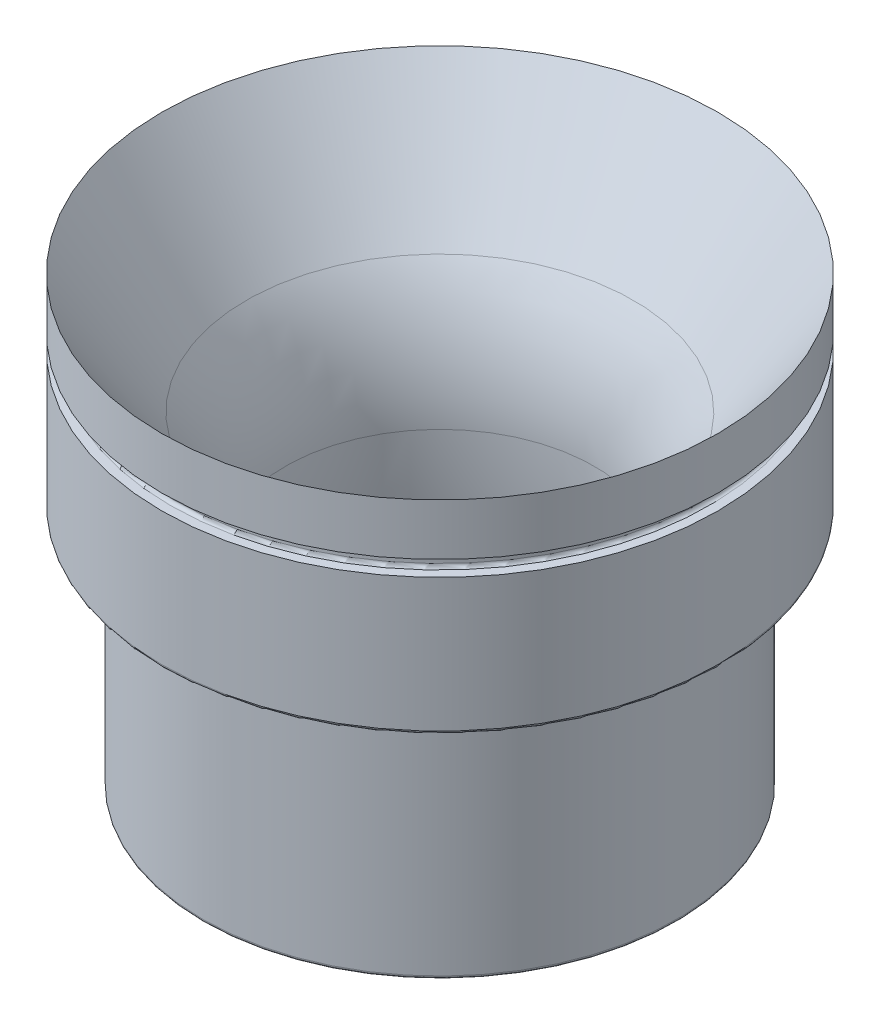
ISO-10303-21;
HEADER;
FILE_DESCRIPTION(('STEP AP214'),'2;1');
FILE_NAME('part.step','',(''),(''),'','','');
FILE_SCHEMA(('AUTOMOTIVE_DESIGN { 1 0 10303 214 1 1 1 1 }'));
ENDSEC;
DATA;
#1=APPLICATION_CONTEXT('core data for automotive mechanical design processes');
#2=APPLICATION_PROTOCOL_DEFINITION('international standard','automotive_design',2000,#1);
#3=PRODUCT_CONTEXT('',#1,'mechanical');
#4=PRODUCT('Part','Part','',(#3));
#5=PRODUCT_RELATED_PRODUCT_CATEGORY('part','',(#4));
#6=PRODUCT_DEFINITION_FORMATION('','',#4);
#7=PRODUCT_DEFINITION_CONTEXT('part definition',#1,'design');
#8=PRODUCT_DEFINITION('design','',#6,#7);
#9=PRODUCT_DEFINITION_SHAPE('','',#8);
#10=(LENGTH_UNIT() NAMED_UNIT(*) SI_UNIT(.MILLI.,.METRE.));
#11=(NAMED_UNIT(*) PLANE_ANGLE_UNIT() SI_UNIT($,.RADIAN.));
#12=(NAMED_UNIT(*) SI_UNIT($,.STERADIAN.) SOLID_ANGLE_UNIT());
#13=UNCERTAINTY_MEASURE_WITH_UNIT(LENGTH_MEASURE(1.E-05),#10,'distance_accuracy_value','');
#14=(GEOMETRIC_REPRESENTATION_CONTEXT(3) GLOBAL_UNCERTAINTY_ASSIGNED_CONTEXT((#13)) GLOBAL_UNIT_ASSIGNED_CONTEXT((#10,
#11,#12)) REPRESENTATION_CONTEXT('',''));
#15=CARTESIAN_POINT('',(0.,0.,0.));
#16=DIRECTION('',(0.,0.,1.));
#17=DIRECTION('',(1.,0.,0.));
#18=AXIS2_PLACEMENT_3D('',#15,#16,#17);
#19=CARTESIAN_POINT('',(0.,0.,0.));
#20=DIRECTION('',(0.,1.,0.));
#21=DIRECTION('',(0.,0.,1.));
#22=AXIS2_PLACEMENT_3D('',#19,#20,#21);
#23=CYLINDRICAL_SURFACE('',#22,34.28365);
#24=CARTESIAN_POINT('',(0.,0.,0.));
#25=DIRECTION('',(0.,1.,0.));
#26=DIRECTION('',(0.,0.,1.));
#27=AXIS2_PLACEMENT_3D('',#24,#25,#26);
#28=CIRCLE('',#27,34.28365);
#29=CARTESIAN_POINT('',(0.,0.,34.28365));
#30=VERTEX_POINT('',#29);
#31=EDGE_CURVE('E97',#30,#30,#28,.T.);
#32=ORIENTED_EDGE('',*,*,#31,.F.);
#33=EDGE_LOOP('',(#32));
#34=FACE_BOUND('',#33,.T.);
#35=CARTESIAN_POINT('',(0.,-6.35,0.));
#36=DIRECTION('',(0.,1.,0.));
#37=DIRECTION('',(0.,0.,1.));
#38=AXIS2_PLACEMENT_3D('',#35,#36,#37);
#39=CIRCLE('',#38,34.28365);
#40=CARTESIAN_POINT('',(0.,-6.35000000000001,34.28365));
#41=VERTEX_POINT('',#40);
#42=EDGE_CURVE('E107',#41,#41,#39,.T.);
#43=ORIENTED_EDGE('',*,*,#42,.T.);
#44=EDGE_LOOP('',(#43));
#45=FACE_BOUND('',#44,.T.);
#46=ADVANCED_FACE('F43',(#34,#45),#23,.T.);
#47=CARTESIAN_POINT('',(0.,-24.6531255823095,0.));
#48=DIRECTION('',(0.,1.,0.));
#49=DIRECTION('',(0.,0.,1.));
#50=AXIS2_PLACEMENT_3D('',#47,#48,#49);
#51=CIRCLE('',#50,34.28365);
#52=CARTESIAN_POINT('',(0.,-24.6531255823095,34.28365));
#53=VERTEX_POINT('',#52);
#54=EDGE_CURVE('E10',#53,#53,#51,.T.);
#55=ORIENTED_EDGE('',*,*,#54,.T.);
#56=EDGE_LOOP('',(#55));
#57=FACE_BOUND('',#56,.T.);
#58=CARTESIAN_POINT('',(0.,-8.25500000000001,0.));
#59=DIRECTION('',(0.,1.,0.));
#60=DIRECTION('',(0.,0.,1.));
#61=AXIS2_PLACEMENT_3D('',#58,#59,#60);
#62=CIRCLE('',#61,34.28365);
#63=CARTESIAN_POINT('',(0.,-8.25500000000001,34.28365));
#64=VERTEX_POINT('',#63);
#65=EDGE_CURVE('E113',#64,#64,#62,.T.);
#66=ORIENTED_EDGE('',*,*,#65,.F.);
#67=EDGE_LOOP('',(#66));
#68=FACE_BOUND('',#67,.T.);
#69=ADVANCED_FACE('F122',(#57,#68),#23,.T.);
#70=CARTESIAN_POINT('',(0.,-30.1649255823095,0.));
#71=DIRECTION('',(0.,1.,0.));
#72=DIRECTION('',(0.,0.,1.));
#73=AXIS2_PLACEMENT_3D('',#70,#71,#72);
#74=TOROIDAL_SURFACE('',#73,114.3,95.25);
#75=CARTESIAN_POINT('',(0.,-54.8072796503094,0.));
#76=DIRECTION('',(0.,1.,0.));
#77=DIRECTION('',(0.,0.,1.));
#78=AXIS2_PLACEMENT_3D('',#75,#76,#77);
#79=CIRCLE('',#78,22.2928432892999);
#80=CARTESIAN_POINT('',(0.,-54.8072796503094,22.2928432892999));
#81=VERTEX_POINT('',#80);
#82=EDGE_CURVE('E95',#81,#81,#79,.T.);
#83=ORIENTED_EDGE('',*,*,#82,.F.);
#84=EDGE_LOOP('',(#83));
#85=FACE_BOUND('',#84,.T.);
#86=CARTESIAN_POINT('',(0.,-30.1649255823095,0.));
#87=DIRECTION('',(0.,1.,0.));
#88=DIRECTION('',(0.,0.,1.));
#89=AXIS2_PLACEMENT_3D('',#86,#87,#88);
#90=CIRCLE('',#89,19.05);
#91=CARTESIAN_POINT('',(0.,-30.1649255823095,19.05));
#92=VERTEX_POINT('',#91);
#93=EDGE_CURVE('E102',#92,#92,#90,.T.);
#94=ORIENTED_EDGE('',*,*,#93,.T.);
#95=EDGE_LOOP('',(#94));
#96=FACE_BOUND('',#95,.T.);
#97=ADVANCED_FACE('F124',(#85,#96),#74,.T.);
#98=CARTESIAN_POINT('',(0.,-54.8072796503094,-29.1846));
#99=DIRECTION('',(0.,1.,0.));
#100=DIRECTION('',(0.,0.,1.));
#101=AXIS2_PLACEMENT_3D('',#98,#99,#100);
#102=PLANE('',#101);
#103=CARTESIAN_POINT('',(0.,-54.8072796503095,0.));
#104=DIRECTION('',(0.,1.,0.));
#105=DIRECTION('',(0.,0.,1.));
#106=AXIS2_PLACEMENT_3D('',#103,#104,#105);
#107=CIRCLE('',#106,28.7782);
#108=CARTESIAN_POINT('',(0.,-54.8072796503095,28.7782));
#109=VERTEX_POINT('',#108);
#110=EDGE_CURVE('E51',#109,#109,#107,.F.);
#111=ORIENTED_EDGE('',*,*,#110,.T.);
#112=EDGE_LOOP('',(#111));
#113=FACE_BOUND('',#112,.T.);
#114=ORIENTED_EDGE('',*,*,#82,.T.);
#115=EDGE_LOOP('',(#114));
#116=FACE_BOUND('',#115,.T.);
#117=ADVANCED_FACE('F126',(#113,#116),#102,.F.);
#118=CARTESIAN_POINT('',(0.,0.,0.));
#119=DIRECTION('',(0.,1.,0.));
#120=DIRECTION('',(0.,0.,1.));
#121=AXIS2_PLACEMENT_3D('',#118,#119,#120);
#122=CYLINDRICAL_SURFACE('',#121,29.1846);
#123=CARTESIAN_POINT('',(0.,-25.4659255823095,0.));
#124=DIRECTION('',(0.,1.,0.));
#125=DIRECTION('',(0.,0.,1.));
#126=AXIS2_PLACEMENT_3D('',#123,#124,#125);
#127=CIRCLE('',#126,29.1846);
#128=CARTESIAN_POINT('',(0.,-25.4659255823095,29.1846));
#129=VERTEX_POINT('',#128);
#130=EDGE_CURVE('E60',#129,#129,#127,.F.);
#131=ORIENTED_EDGE('',*,*,#130,.T.);
#132=EDGE_LOOP('',(#131));
#133=FACE_BOUND('',#132,.T.);
#134=CARTESIAN_POINT('',(0.,-54.4008796503094,0.));
#135=DIRECTION('',(0.,1.,0.));
#136=DIRECTION('',(0.,0.,1.));
#137=AXIS2_PLACEMENT_3D('',#134,#135,#136);
#138=CIRCLE('',#137,29.1846);
#139=CARTESIAN_POINT('',(0.,-54.4008796503095,29.1846));
#140=VERTEX_POINT('',#139);
#141=EDGE_CURVE('E62',#140,#140,#138,.T.);
#142=ORIENTED_EDGE('',*,*,#141,.T.);
#143=EDGE_LOOP('',(#142));
#144=FACE_BOUND('',#143,.T.);
#145=ADVANCED_FACE('F142',(#133,#144),#122,.T.);
#146=CARTESIAN_POINT('',(0.,-25.0595255823095,-34.28365));
#147=DIRECTION('',(0.,1.,0.));
#148=DIRECTION('',(0.,0.,1.));
#149=AXIS2_PLACEMENT_3D('',#146,#147,#148);
#150=PLANE('',#149);
#151=CARTESIAN_POINT('',(0.,-25.0595255823095,0.));
#152=DIRECTION('',(0.,1.,0.));
#153=DIRECTION('',(0.,0.,1.));
#154=AXIS2_PLACEMENT_3D('',#151,#152,#153);
#155=CIRCLE('',#154,29.591);
#156=CARTESIAN_POINT('',(0.,-25.0595255823095,29.591));
#157=VERTEX_POINT('',#156);
#158=EDGE_CURVE('E70',#157,#157,#155,.T.);
#159=ORIENTED_EDGE('',*,*,#158,.T.);
#160=EDGE_LOOP('',(#159));
#161=FACE_BOUND('',#160,.T.);
#162=CARTESIAN_POINT('',(0.,-25.0595255823095,0.));
#163=DIRECTION('',(0.,1.,0.));
#164=DIRECTION('',(0.,0.,1.));
#165=AXIS2_PLACEMENT_3D('',#162,#163,#164);
#166=CIRCLE('',#165,33.87725);
#167=CARTESIAN_POINT('',(0.,-25.0595255823095,33.87725));
#168=VERTEX_POINT('',#167);
#169=EDGE_CURVE('E71',#168,#168,#166,.F.);
#170=ORIENTED_EDGE('',*,*,#169,.T.);
#171=EDGE_LOOP('',(#170));
#172=FACE_BOUND('',#171,.T.);
#173=ADVANCED_FACE('F136',(#161,#172),#150,.F.);
#174=CARTESIAN_POINT('',(0.,0.,0.));
#175=DIRECTION('',(0.,1.,0.));
#176=DIRECTION('',(0.,0.,1.));
#177=AXIS2_PLACEMENT_3D('',#174,#175,#176);
#178=CONICAL_SURFACE('',#177,34.28365,0.610865238198017);
#179=CARTESIAN_POINT('',(0.,-14.867642024827,0.));
#180=DIRECTION('',(0.,1.,0.));
#181=DIRECTION('',(0.,0.,1.));
#182=AXIS2_PLACEMENT_3D('',#179,#180,#181);
#183=CIRCLE('',#182,23.8732149788126);
#184=CARTESIAN_POINT('',(0.,-14.867642024827,23.8732149788126));
#185=VERTEX_POINT('',#184);
#186=EDGE_CURVE('E103',#185,#185,#183,.T.);
#187=ORIENTED_EDGE('',*,*,#186,.F.);
#188=EDGE_LOOP('',(#187));
#189=FACE_BOUND('',#188,.T.);
#190=ORIENTED_EDGE('',*,*,#31,.T.);
#191=EDGE_LOOP('',(#190));
#192=FACE_BOUND('',#191,.T.);
#193=ADVANCED_FACE('F138',(#189,#192),#178,.F.);
#194=CARTESIAN_POINT('',(0.,-30.1649255823095,0.));
#195=DIRECTION('',(0.,1.,0.));
#196=DIRECTION('',(0.,0.,1.));
#197=AXIS2_PLACEMENT_3D('',#194,#195,#196);
#198=TOROIDAL_SURFACE('',#197,45.72,26.67);
#199=ORIENTED_EDGE('',*,*,#93,.F.);
#200=EDGE_LOOP('',(#199));
#201=FACE_BOUND('',#200,.T.);
#202=ORIENTED_EDGE('',*,*,#186,.T.);
#203=EDGE_LOOP('',(#202));
#204=FACE_BOUND('',#203,.T.);
#205=ADVANCED_FACE('F223',(#201,#204),#198,.T.);
#206=CARTESIAN_POINT('',(0.,-6.35,-34.28365));
#207=DIRECTION('',(0.,-1.,0.));
#208=DIRECTION('',(0.,0.,-1.));
#209=AXIS2_PLACEMENT_3D('',#206,#207,#208);
#210=PLANE('',#209);
#211=CARTESIAN_POINT('',(0.,-6.35,0.));
#212=DIRECTION('',(0.,-1.,0.));
#213=DIRECTION('',(0.,0.,-1.));
#214=AXIS2_PLACEMENT_3D('',#211,#212,#213);
#215=CIRCLE('',#214,33.1724);
#216=CARTESIAN_POINT('',(0.,-6.35,-33.1724));
#217=VERTEX_POINT('',#216);
#218=EDGE_CURVE('E90',#217,#217,#215,.F.);
#219=ORIENTED_EDGE('',*,*,#218,.T.);
#220=EDGE_LOOP('',(#219));
#221=FACE_BOUND('',#220,.T.);
#222=ORIENTED_EDGE('',*,*,#42,.F.);
#223=EDGE_LOOP('',(#222));
#224=FACE_BOUND('',#223,.T.);
#225=ADVANCED_FACE('F211',(#221,#224),#210,.T.);
#226=CARTESIAN_POINT('',(0.,11.364369062704,0.));
#227=DIRECTION('',(0.,1.,0.));
#228=DIRECTION('',(0.,0.,1.));
#229=AXIS2_PLACEMENT_3D('',#226,#227,#228);
#230=CYLINDRICAL_SURFACE('',#229,32.766);
#231=CARTESIAN_POINT('',(0.,-6.7564,0.));
#232=DIRECTION('',(0.,-1.,0.));
#233=DIRECTION('',(0.,0.,-1.));
#234=AXIS2_PLACEMENT_3D('',#231,#232,#233);
#235=CIRCLE('',#234,32.766);
#236=CARTESIAN_POINT('',(0.,-6.7564,-32.766));
#237=VERTEX_POINT('',#236);
#238=EDGE_CURVE('E83',#237,#237,#235,.T.);
#239=ORIENTED_EDGE('',*,*,#238,.T.);
#240=EDGE_LOOP('',(#239));
#241=FACE_BOUND('',#240,.T.);
#242=CARTESIAN_POINT('',(0.,-7.8486,0.));
#243=DIRECTION('',(0.,1.,0.));
#244=DIRECTION('',(0.,0.,1.));
#245=AXIS2_PLACEMENT_3D('',#242,#243,#244);
#246=CIRCLE('',#245,32.766);
#247=CARTESIAN_POINT('',(0.,-7.84860000000001,32.766));
#248=VERTEX_POINT('',#247);
#249=EDGE_CURVE('E81',#248,#248,#246,.T.);
#250=ORIENTED_EDGE('',*,*,#249,.T.);
#251=EDGE_LOOP('',(#250));
#252=FACE_BOUND('',#251,.T.);
#253=ADVANCED_FACE('F204',(#241,#252),#230,.T.);
#254=CARTESIAN_POINT('',(0.,-8.255,-32.766));
#255=DIRECTION('',(0.,1.,0.));
#256=DIRECTION('',(0.,0.,1.));
#257=AXIS2_PLACEMENT_3D('',#254,#255,#256);
#258=PLANE('',#257);
#259=CARTESIAN_POINT('',(0.,-8.25500000000001,0.));
#260=DIRECTION('',(0.,1.,0.));
#261=DIRECTION('',(0.,0.,1.));
#262=AXIS2_PLACEMENT_3D('',#259,#260,#261);
#263=CIRCLE('',#262,33.1724);
#264=CARTESIAN_POINT('',(0.,-8.25500000000001,33.1724));
#265=VERTEX_POINT('',#264);
#266=EDGE_CURVE('E80',#265,#265,#263,.F.);
#267=ORIENTED_EDGE('',*,*,#266,.T.);
#268=EDGE_LOOP('',(#267));
#269=FACE_BOUND('',#268,.T.);
#270=ORIENTED_EDGE('',*,*,#65,.T.);
#271=EDGE_LOOP('',(#270));
#272=FACE_BOUND('',#271,.T.);
#273=ADVANCED_FACE('F118',(#269,#272),#258,.T.);
#274=CARTESIAN_POINT('',(0.,-6.7564,0.));
#275=DIRECTION('',(0.,-1.,0.));
#276=DIRECTION('',(0.,0.,-1.));
#277=AXIS2_PLACEMENT_3D('',#274,#275,#276);
#278=TOROIDAL_SURFACE('',#277,33.1724,0.4064);
#279=ORIENTED_EDGE('',*,*,#238,.F.);
#280=EDGE_LOOP('',(#279));
#281=FACE_BOUND('',#280,.T.);
#282=ORIENTED_EDGE('',*,*,#218,.F.);
#283=EDGE_LOOP('',(#282));
#284=FACE_BOUND('',#283,.T.);
#285=ADVANCED_FACE('F149',(#281,#284),#278,.F.);
#286=CARTESIAN_POINT('',(0.,-7.8486,0.));
#287=DIRECTION('',(0.,1.,0.));
#288=DIRECTION('',(0.,0.,1.));
#289=AXIS2_PLACEMENT_3D('',#286,#287,#288);
#290=TOROIDAL_SURFACE('',#289,33.1724,0.4064);
#291=ORIENTED_EDGE('',*,*,#266,.F.);
#292=EDGE_LOOP('',(#291));
#293=FACE_BOUND('',#292,.T.);
#294=ORIENTED_EDGE('',*,*,#249,.F.);
#295=EDGE_LOOP('',(#294));
#296=FACE_BOUND('',#295,.T.);
#297=ADVANCED_FACE('F146',(#293,#296),#290,.F.);
#298=CARTESIAN_POINT('',(0.,-25.4659255823095,0.));
#299=DIRECTION('',(0.,1.,0.));
#300=DIRECTION('',(0.,0.,1.));
#301=AXIS2_PLACEMENT_3D('',#298,#299,#300);
#302=TOROIDAL_SURFACE('',#301,29.591,0.4064);
#303=ORIENTED_EDGE('',*,*,#130,.F.);
#304=EDGE_LOOP('',(#303));
#305=FACE_BOUND('',#304,.T.);
#306=ORIENTED_EDGE('',*,*,#158,.F.);
#307=EDGE_LOOP('',(#306));
#308=FACE_BOUND('',#307,.T.);
#309=ADVANCED_FACE('F155',(#305,#308),#302,.F.);
#310=CARTESIAN_POINT('',(0.,-54.4008796503094,0.));
#311=DIRECTION('',(0.,1.,0.));
#312=DIRECTION('',(0.,0.,1.));
#313=AXIS2_PLACEMENT_3D('',#310,#311,#312);
#314=TOROIDAL_SURFACE('',#313,28.7782,0.4064);
#315=ORIENTED_EDGE('',*,*,#110,.F.);
#316=EDGE_LOOP('',(#315));
#317=FACE_BOUND('',#316,.T.);
#318=ORIENTED_EDGE('',*,*,#141,.F.);
#319=EDGE_LOOP('',(#318));
#320=FACE_BOUND('',#319,.T.);
#321=ADVANCED_FACE('F159',(#317,#320),#314,.T.);
#322=CARTESIAN_POINT('',(0.,-24.6531255823095,0.));
#323=DIRECTION('',(0.,1.,0.));
#324=DIRECTION('',(0.,0.,1.));
#325=AXIS2_PLACEMENT_3D('',#322,#323,#324);
#326=TOROIDAL_SURFACE('',#325,33.87725,0.4064);
#327=ORIENTED_EDGE('',*,*,#169,.F.);
#328=EDGE_LOOP('',(#327));
#329=FACE_BOUND('',#328,.T.);
#330=ORIENTED_EDGE('',*,*,#54,.F.);
#331=EDGE_LOOP('',(#330));
#332=FACE_BOUND('',#331,.T.);
#333=ADVANCED_FACE('F44',(#329,#332),#326,.T.);
#334=CLOSED_SHELL('',(#46,#69,#97,#117,#145,#173,#193,#205,#225,#253,#273,#285,#297,#309,#321,#333));
#335=MANIFOLD_SOLID_BREP('B2',#334);
#336=ADVANCED_BREP_SHAPE_REPRESENTATION('',(#18,#335),#14);
#337=SHAPE_DEFINITION_REPRESENTATION(#9,#336);
ENDSEC;
END-ISO-10303-21;
